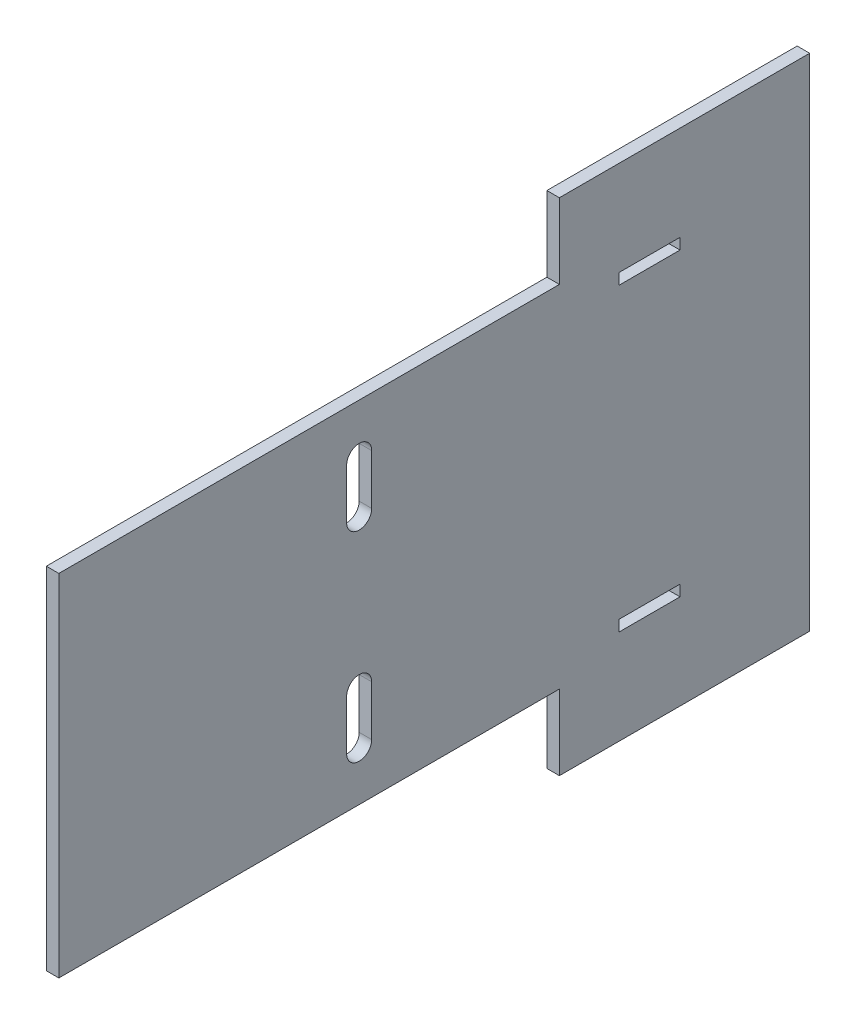
ISO-10303-21;
HEADER;
FILE_DESCRIPTION(('STEP AP214'),'2;1');
FILE_NAME('part.step','',(''),(''),'','','');
FILE_SCHEMA(('AUTOMOTIVE_DESIGN { 1 0 10303 214 1 1 1 1 }'));
ENDSEC;
DATA;
#1=APPLICATION_CONTEXT('core data for automotive mechanical design processes');
#2=APPLICATION_PROTOCOL_DEFINITION('international standard','automotive_design',2000,#1);
#3=PRODUCT_CONTEXT('',#1,'mechanical');
#4=PRODUCT('Part','Part','',(#3));
#5=PRODUCT_RELATED_PRODUCT_CATEGORY('part','',(#4));
#6=PRODUCT_DEFINITION_FORMATION('','',#4);
#7=PRODUCT_DEFINITION_CONTEXT('part definition',#1,'design');
#8=PRODUCT_DEFINITION('design','',#6,#7);
#9=PRODUCT_DEFINITION_SHAPE('','',#8);
#10=(LENGTH_UNIT() NAMED_UNIT(*) SI_UNIT(.MILLI.,.METRE.));
#11=(NAMED_UNIT(*) PLANE_ANGLE_UNIT() SI_UNIT($,.RADIAN.));
#12=(NAMED_UNIT(*) SI_UNIT($,.STERADIAN.) SOLID_ANGLE_UNIT());
#13=UNCERTAINTY_MEASURE_WITH_UNIT(LENGTH_MEASURE(1.E-05),#10,'distance_accuracy_value','');
#14=(GEOMETRIC_REPRESENTATION_CONTEXT(3) GLOBAL_UNCERTAINTY_ASSIGNED_CONTEXT((#13)) GLOBAL_UNIT_ASSIGNED_CONTEXT((#10,
#11,#12)) REPRESENTATION_CONTEXT('',''));
#15=CARTESIAN_POINT('',(0.,0.,0.));
#16=DIRECTION('',(0.,0.,1.));
#17=DIRECTION('',(1.,0.,0.));
#18=AXIS2_PLACEMENT_3D('',#15,#16,#17);
#19=CARTESIAN_POINT('',(2.5,35.,150.));
#20=DIRECTION('',(0.,0.,-1.));
#21=DIRECTION('',(-1.,0.,0.));
#22=AXIS2_PLACEMENT_3D('',#19,#20,#21);
#23=PLANE('',#22);
#24=DIRECTION('',(0.,-1.,0.));
#25=VECTOR('',#24,1.);
#26=CARTESIAN_POINT('',(0.,35.,150.));
#27=LINE('',#26,#25);
#28=CARTESIAN_POINT('',(0.,35.,150.));
#29=VERTEX_POINT('',#28);
#30=CARTESIAN_POINT('',(0.,-35.,150.));
#31=VERTEX_POINT('',#30);
#32=EDGE_CURVE('E297',#29,#31,#27,.T.);
#33=ORIENTED_EDGE('',*,*,#32,.T.);
#34=DIRECTION('',(-1.,0.,0.));
#35=VECTOR('',#34,1.);
#36=CARTESIAN_POINT('',(2.5,-35.,150.));
#37=LINE('',#36,#35);
#38=CARTESIAN_POINT('',(2.5,-35.,150.));
#39=VERTEX_POINT('',#38);
#40=EDGE_CURVE('E11',#39,#31,#37,.T.);
#41=ORIENTED_EDGE('',*,*,#40,.F.);
#42=DIRECTION('',(0.,-1.,0.));
#43=VECTOR('',#42,1.);
#44=CARTESIAN_POINT('',(2.5,35.,150.));
#45=LINE('',#44,#43);
#46=CARTESIAN_POINT('',(2.5,35.,150.));
#47=VERTEX_POINT('',#46);
#48=EDGE_CURVE('E334',#47,#39,#45,.T.);
#49=ORIENTED_EDGE('',*,*,#48,.F.);
#50=DIRECTION('',(-1.,0.,0.));
#51=VECTOR('',#50,1.);
#52=CARTESIAN_POINT('',(2.5,35.,150.));
#53=LINE('',#52,#51);
#54=EDGE_CURVE('E352',#47,#29,#53,.T.);
#55=ORIENTED_EDGE('',*,*,#54,.T.);
#56=EDGE_LOOP('',(#33,#41,#49,#55));
#57=FACE_BOUND('',#56,.T.);
#58=ADVANCED_FACE('F39',(#57),#23,.F.);
#59=CARTESIAN_POINT('',(2.5,-35.,150.));
#60=DIRECTION('',(0.,1.,0.));
#61=DIRECTION('',(0.,0.,1.));
#62=AXIS2_PLACEMENT_3D('',#59,#60,#61);
#63=PLANE('',#62);
#64=DIRECTION('',(0.,0.,-1.));
#65=VECTOR('',#64,1.);
#66=CARTESIAN_POINT('',(0.,-35.,150.));
#67=LINE('',#66,#65);
#68=CARTESIAN_POINT('',(0.,-35.,50.));
#69=VERTEX_POINT('',#68);
#70=EDGE_CURVE('E355',#31,#69,#67,.T.);
#71=ORIENTED_EDGE('',*,*,#70,.T.);
#72=DIRECTION('',(-1.,0.,0.));
#73=VECTOR('',#72,1.);
#74=CARTESIAN_POINT('',(2.5,-35.,50.));
#75=LINE('',#74,#73);
#76=CARTESIAN_POINT('',(2.5,-35.,50.));
#77=VERTEX_POINT('',#76);
#78=EDGE_CURVE('E46',#77,#69,#75,.T.);
#79=ORIENTED_EDGE('',*,*,#78,.F.);
#80=DIRECTION('',(0.,0.,-1.));
#81=VECTOR('',#80,1.);
#82=CARTESIAN_POINT('',(2.5,-35.,150.));
#83=LINE('',#82,#81);
#84=EDGE_CURVE('E337',#39,#77,#83,.T.);
#85=ORIENTED_EDGE('',*,*,#84,.F.);
#86=ORIENTED_EDGE('',*,*,#40,.T.);
#87=EDGE_LOOP('',(#71,#79,#85,#86));
#88=FACE_BOUND('',#87,.T.);
#89=ADVANCED_FACE('F411',(#88),#63,.F.);
#90=CARTESIAN_POINT('',(2.5,-35.,50.));
#91=DIRECTION('',(0.,0.,-1.));
#92=DIRECTION('',(0.,1.,0.));
#93=AXIS2_PLACEMENT_3D('',#90,#91,#92);
#94=PLANE('',#93);
#95=DIRECTION('',(0.,-1.,0.));
#96=VECTOR('',#95,1.);
#97=CARTESIAN_POINT('',(0.,-35.,50.));
#98=LINE('',#97,#96);
#99=CARTESIAN_POINT('',(0.,-50.,50.));
#100=VERTEX_POINT('',#99);
#101=EDGE_CURVE('E357',#69,#100,#98,.T.);
#102=ORIENTED_EDGE('',*,*,#101,.T.);
#103=DIRECTION('',(-1.,0.,0.));
#104=VECTOR('',#103,1.);
#105=CARTESIAN_POINT('',(2.5,-50.,50.));
#106=LINE('',#105,#104);
#107=CARTESIAN_POINT('',(2.5,-50.,50.));
#108=VERTEX_POINT('',#107);
#109=EDGE_CURVE('E383',#108,#100,#106,.T.);
#110=ORIENTED_EDGE('',*,*,#109,.F.);
#111=DIRECTION('',(0.,-1.,0.));
#112=VECTOR('',#111,1.);
#113=CARTESIAN_POINT('',(2.5,-35.,50.));
#114=LINE('',#113,#112);
#115=EDGE_CURVE('E340',#77,#108,#114,.T.);
#116=ORIENTED_EDGE('',*,*,#115,.F.);
#117=ORIENTED_EDGE('',*,*,#78,.T.);
#118=EDGE_LOOP('',(#102,#110,#116,#117));
#119=FACE_BOUND('',#118,.T.);
#120=ADVANCED_FACE('F390',(#119),#94,.F.);
#121=CARTESIAN_POINT('',(2.5,-50.,50.));
#122=DIRECTION('',(0.,1.,0.));
#123=DIRECTION('',(0.,0.,1.));
#124=AXIS2_PLACEMENT_3D('',#121,#122,#123);
#125=PLANE('',#124);
#126=DIRECTION('',(0.,0.,-1.));
#127=VECTOR('',#126,1.);
#128=CARTESIAN_POINT('',(0.,-50.,50.));
#129=LINE('',#128,#127);
#130=CARTESIAN_POINT('',(0.,-50.,0.));
#131=VERTEX_POINT('',#130);
#132=EDGE_CURVE('E359',#100,#131,#129,.T.);
#133=ORIENTED_EDGE('',*,*,#132,.T.);
#134=DIRECTION('',(-1.,0.,0.));
#135=VECTOR('',#134,1.);
#136=CARTESIAN_POINT('',(2.5,-50.,0.));
#137=LINE('',#136,#135);
#138=CARTESIAN_POINT('',(2.5,-50.,0.));
#139=VERTEX_POINT('',#138);
#140=EDGE_CURVE('E380',#139,#131,#137,.T.);
#141=ORIENTED_EDGE('',*,*,#140,.F.);
#142=DIRECTION('',(0.,0.,-1.));
#143=VECTOR('',#142,1.);
#144=CARTESIAN_POINT('',(2.5,-50.,50.));
#145=LINE('',#144,#143);
#146=EDGE_CURVE('E342',#108,#139,#145,.T.);
#147=ORIENTED_EDGE('',*,*,#146,.F.);
#148=ORIENTED_EDGE('',*,*,#109,.T.);
#149=EDGE_LOOP('',(#133,#141,#147,#148));
#150=FACE_BOUND('',#149,.T.);
#151=ADVANCED_FACE('F400',(#150),#125,.F.);
#152=CARTESIAN_POINT('',(2.5,0.,0.));
#153=DIRECTION('',(0.,0.,1.));
#154=DIRECTION('',(1.,0.,0.));
#155=AXIS2_PLACEMENT_3D('',#152,#153,#154);
#156=PLANE('',#155);
#157=DIRECTION('',(0.,1.,0.));
#158=VECTOR('',#157,1.);
#159=CARTESIAN_POINT('',(0.,0.,0.));
#160=LINE('',#159,#158);
#161=CARTESIAN_POINT('',(0.,50.,0.));
#162=VERTEX_POINT('',#161);
#163=EDGE_CURVE('E362',#131,#162,#160,.T.);
#164=ORIENTED_EDGE('',*,*,#163,.T.);
#165=DIRECTION('',(-1.,0.,0.));
#166=VECTOR('',#165,1.);
#167=CARTESIAN_POINT('',(2.5,50.,0.));
#168=LINE('',#167,#166);
#169=CARTESIAN_POINT('',(2.5,50.,0.));
#170=VERTEX_POINT('',#169);
#171=EDGE_CURVE('E377',#170,#162,#168,.T.);
#172=ORIENTED_EDGE('',*,*,#171,.F.);
#173=DIRECTION('',(0.,1.,0.));
#174=VECTOR('',#173,1.);
#175=CARTESIAN_POINT('',(2.5,-50.,0.));
#176=LINE('',#175,#174);
#177=EDGE_CURVE('E344',#139,#170,#176,.T.);
#178=ORIENTED_EDGE('',*,*,#177,.F.);
#179=ORIENTED_EDGE('',*,*,#140,.T.);
#180=EDGE_LOOP('',(#164,#172,#178,#179));
#181=FACE_BOUND('',#180,.T.);
#182=ADVANCED_FACE('F404',(#181),#156,.F.);
#183=CARTESIAN_POINT('',(2.5,50.,0.));
#184=DIRECTION('',(0.,-1.,0.));
#185=DIRECTION('',(0.,0.,-1.));
#186=AXIS2_PLACEMENT_3D('',#183,#184,#185);
#187=PLANE('',#186);
#188=DIRECTION('',(0.,0.,1.));
#189=VECTOR('',#188,1.);
#190=CARTESIAN_POINT('',(0.,50.,0.));
#191=LINE('',#190,#189);
#192=CARTESIAN_POINT('',(0.,50.,50.));
#193=VERTEX_POINT('',#192);
#194=EDGE_CURVE('E364',#162,#193,#191,.T.);
#195=ORIENTED_EDGE('',*,*,#194,.T.);
#196=DIRECTION('',(-1.,0.,0.));
#197=VECTOR('',#196,1.);
#198=CARTESIAN_POINT('',(2.5,50.,50.));
#199=LINE('',#198,#197);
#200=CARTESIAN_POINT('',(2.5,50.,50.));
#201=VERTEX_POINT('',#200);
#202=EDGE_CURVE('E374',#201,#193,#199,.T.);
#203=ORIENTED_EDGE('',*,*,#202,.F.);
#204=DIRECTION('',(0.,0.,1.));
#205=VECTOR('',#204,1.);
#206=CARTESIAN_POINT('',(2.5,50.,0.));
#207=LINE('',#206,#205);
#208=EDGE_CURVE('E346',#170,#201,#207,.T.);
#209=ORIENTED_EDGE('',*,*,#208,.F.);
#210=ORIENTED_EDGE('',*,*,#171,.T.);
#211=EDGE_LOOP('',(#195,#203,#209,#210));
#212=FACE_BOUND('',#211,.T.);
#213=ADVANCED_FACE('F424',(#212),#187,.F.);
#214=CARTESIAN_POINT('',(2.5,50.,50.));
#215=DIRECTION('',(0.,0.,-1.));
#216=DIRECTION('',(-1.,0.,0.));
#217=AXIS2_PLACEMENT_3D('',#214,#215,#216);
#218=PLANE('',#217);
#219=DIRECTION('',(0.,-1.,0.));
#220=VECTOR('',#219,1.);
#221=CARTESIAN_POINT('',(0.,50.,50.));
#222=LINE('',#221,#220);
#223=CARTESIAN_POINT('',(0.,35.,50.));
#224=VERTEX_POINT('',#223);
#225=EDGE_CURVE('E366',#193,#224,#222,.T.);
#226=ORIENTED_EDGE('',*,*,#225,.T.);
#227=DIRECTION('',(-1.,0.,0.));
#228=VECTOR('',#227,1.);
#229=CARTESIAN_POINT('',(2.5,35.,50.));
#230=LINE('',#229,#228);
#231=CARTESIAN_POINT('',(2.5,35.,50.));
#232=VERTEX_POINT('',#231);
#233=EDGE_CURVE('E371',#232,#224,#230,.T.);
#234=ORIENTED_EDGE('',*,*,#233,.F.);
#235=DIRECTION('',(0.,-1.,0.));
#236=VECTOR('',#235,1.);
#237=CARTESIAN_POINT('',(2.5,50.,50.));
#238=LINE('',#237,#236);
#239=EDGE_CURVE('E348',#201,#232,#238,.T.);
#240=ORIENTED_EDGE('',*,*,#239,.F.);
#241=ORIENTED_EDGE('',*,*,#202,.T.);
#242=EDGE_LOOP('',(#226,#234,#240,#241));
#243=FACE_BOUND('',#242,.T.);
#244=ADVANCED_FACE('F422',(#243),#218,.F.);
#245=CARTESIAN_POINT('',(2.5,35.,50.));
#246=DIRECTION('',(0.,-1.,0.));
#247=DIRECTION('',(0.,0.,-1.));
#248=AXIS2_PLACEMENT_3D('',#245,#246,#247);
#249=PLANE('',#248);
#250=DIRECTION('',(0.,0.,1.));
#251=VECTOR('',#250,1.);
#252=CARTESIAN_POINT('',(0.,35.,50.));
#253=LINE('',#252,#251);
#254=EDGE_CURVE('E338',#224,#29,#253,.T.);
#255=ORIENTED_EDGE('',*,*,#254,.T.);
#256=ORIENTED_EDGE('',*,*,#54,.F.);
#257=DIRECTION('',(0.,0.,1.));
#258=VECTOR('',#257,1.);
#259=CARTESIAN_POINT('',(2.5,35.,50.));
#260=LINE('',#259,#258);
#261=EDGE_CURVE('E350',#232,#47,#260,.T.);
#262=ORIENTED_EDGE('',*,*,#261,.F.);
#263=ORIENTED_EDGE('',*,*,#233,.T.);
#264=EDGE_LOOP('',(#255,#256,#262,#263));
#265=FACE_BOUND('',#264,.T.);
#266=ADVANCED_FACE('F417',(#265),#249,.F.);
#267=CARTESIAN_POINT('',(2.5,0.,0.));
#268=DIRECTION('',(1.,0.,0.));
#269=DIRECTION('',(0.,0.,-1.));
#270=AXIS2_PLACEMENT_3D('',#267,#268,#269);
#271=PLANE('',#270);
#272=CARTESIAN_POINT('',(2.5,25.,90.));
#273=DIRECTION('',(-1.,0.,0.));
#274=DIRECTION('',(0.,0.,-1.));
#275=AXIS2_PLACEMENT_3D('',#272,#273,#274);
#276=CIRCLE('',#275,2.5);
#277=CARTESIAN_POINT('',(2.5,25.,92.5));
#278=VERTEX_POINT('',#277);
#279=CARTESIAN_POINT('',(2.5,25.,87.5));
#280=VERTEX_POINT('',#279);
#281=EDGE_CURVE('E203',#278,#280,#276,.T.);
#282=ORIENTED_EDGE('',*,*,#281,.T.);
#283=DIRECTION('',(0.,-1.,0.));
#284=VECTOR('',#283,1.);
#285=CARTESIAN_POINT('',(2.5,15.,87.5));
#286=LINE('',#285,#284);
#287=CARTESIAN_POINT('',(2.5,15.,87.5));
#288=VERTEX_POINT('',#287);
#289=EDGE_CURVE('E214',#280,#288,#286,.T.);
#290=ORIENTED_EDGE('',*,*,#289,.T.);
#291=CARTESIAN_POINT('',(2.5,15.,90.));
#292=DIRECTION('',(-1.,0.,0.));
#293=DIRECTION('',(0.,0.,-1.));
#294=AXIS2_PLACEMENT_3D('',#291,#292,#293);
#295=CIRCLE('',#294,2.5);
#296=CARTESIAN_POINT('',(2.5,15.,92.5));
#297=VERTEX_POINT('',#296);
#298=EDGE_CURVE('E53',#288,#297,#295,.T.);
#299=ORIENTED_EDGE('',*,*,#298,.T.);
#300=DIRECTION('',(0.,1.,0.));
#301=VECTOR('',#300,1.);
#302=CARTESIAN_POINT('',(2.5,25.,92.5));
#303=LINE('',#302,#301);
#304=EDGE_CURVE('E211',#297,#278,#303,.T.);
#305=ORIENTED_EDGE('',*,*,#304,.T.);
#306=EDGE_LOOP('',(#282,#290,#299,#305));
#307=FACE_BOUND('',#306,.T.);
#308=CARTESIAN_POINT('',(2.5,-15.,90.));
#309=DIRECTION('',(-1.,0.,0.));
#310=DIRECTION('',(0.,0.,1.));
#311=AXIS2_PLACEMENT_3D('',#308,#309,#310);
#312=CIRCLE('',#311,2.5);
#313=CARTESIAN_POINT('',(2.5,-15.,92.5));
#314=VERTEX_POINT('',#313);
#315=CARTESIAN_POINT('',(2.5,-15.,87.5));
#316=VERTEX_POINT('',#315);
#317=EDGE_CURVE('E255',#314,#316,#312,.T.);
#318=ORIENTED_EDGE('',*,*,#317,.T.);
#319=DIRECTION('',(0.,-1.,0.));
#320=VECTOR('',#319,1.);
#321=CARTESIAN_POINT('',(2.5,-25.,87.5));
#322=LINE('',#321,#320);
#323=CARTESIAN_POINT('',(2.5,-25.,87.5));
#324=VERTEX_POINT('',#323);
#325=EDGE_CURVE('E265',#316,#324,#322,.T.);
#326=ORIENTED_EDGE('',*,*,#325,.T.);
#327=CARTESIAN_POINT('',(2.5,-25.,90.));
#328=DIRECTION('',(-1.,0.,0.));
#329=DIRECTION('',(0.,0.,-1.));
#330=AXIS2_PLACEMENT_3D('',#327,#328,#329);
#331=CIRCLE('',#330,2.5);
#332=CARTESIAN_POINT('',(2.5,-25.,92.5));
#333=VERTEX_POINT('',#332);
#334=EDGE_CURVE('E61',#324,#333,#331,.T.);
#335=ORIENTED_EDGE('',*,*,#334,.T.);
#336=DIRECTION('',(0.,1.,0.));
#337=VECTOR('',#336,1.);
#338=CARTESIAN_POINT('',(2.5,-15.,92.5));
#339=LINE('',#338,#337);
#340=EDGE_CURVE('E244',#333,#314,#339,.T.);
#341=ORIENTED_EDGE('',*,*,#340,.T.);
#342=EDGE_LOOP('',(#318,#326,#335,#341));
#343=FACE_BOUND('',#342,.T.);
#344=DIRECTION('',(0.,1.,0.));
#345=VECTOR('',#344,1.);
#346=CARTESIAN_POINT('',(2.5,31.0999999999997,38.0999999999999));
#347=LINE('',#346,#345);
#348=CARTESIAN_POINT('',(2.5,28.8999999999997,38.0999999999999));
#349=VERTEX_POINT('',#348);
#350=CARTESIAN_POINT('',(2.5,31.0999999999997,38.0999999999999));
#351=VERTEX_POINT('',#350);
#352=EDGE_CURVE('E270',#349,#351,#347,.T.);
#353=ORIENTED_EDGE('',*,*,#352,.T.);
#354=DIRECTION('',(0.,0.,-1.));
#355=VECTOR('',#354,1.);
#356=CARTESIAN_POINT('',(2.5,31.0999999999997,25.8999999999999));
#357=LINE('',#356,#355);
#358=CARTESIAN_POINT('',(2.5,31.0999999999997,25.8999999999999));
#359=VERTEX_POINT('',#358);
#360=EDGE_CURVE('E273',#351,#359,#357,.T.);
#361=ORIENTED_EDGE('',*,*,#360,.T.);
#362=DIRECTION('',(0.,-1.,0.));
#363=VECTOR('',#362,1.);
#364=CARTESIAN_POINT('',(2.5,28.8999999999997,25.8999999999999));
#365=LINE('',#364,#363);
#366=CARTESIAN_POINT('',(2.5,28.8999999999997,25.8999999999999));
#367=VERTEX_POINT('',#366);
#368=EDGE_CURVE('E277',#359,#367,#365,.T.);
#369=ORIENTED_EDGE('',*,*,#368,.T.);
#370=DIRECTION('',(0.,0.,1.));
#371=VECTOR('',#370,1.);
#372=CARTESIAN_POINT('',(2.5,28.8999999999997,38.0999999999999));
#373=LINE('',#372,#371);
#374=EDGE_CURVE('E280',#367,#349,#373,.T.);
#375=ORIENTED_EDGE('',*,*,#374,.T.);
#376=EDGE_LOOP('',(#353,#361,#369,#375));
#377=FACE_BOUND('',#376,.T.);
#378=DIRECTION('',(0.,0.,-1.));
#379=VECTOR('',#378,1.);
#380=CARTESIAN_POINT('',(2.5,-28.8999999999997,38.0999999999999));
#381=LINE('',#380,#379);
#382=CARTESIAN_POINT('',(2.5,-28.8999999999997,38.0999999999999));
#383=VERTEX_POINT('',#382);
#384=CARTESIAN_POINT('',(2.5,-28.8999999999997,25.8999999999999));
#385=VERTEX_POINT('',#384);
#386=EDGE_CURVE('E317',#383,#385,#381,.T.);
#387=ORIENTED_EDGE('',*,*,#386,.T.);
#388=DIRECTION('',(0.,-1.,0.));
#389=VECTOR('',#388,1.);
#390=CARTESIAN_POINT('',(2.5,-28.8999999999997,25.8999999999999));
#391=LINE('',#390,#389);
#392=CARTESIAN_POINT('',(2.5,-31.0999999999997,25.8999999999999));
#393=VERTEX_POINT('',#392);
#394=EDGE_CURVE('E329',#385,#393,#391,.T.);
#395=ORIENTED_EDGE('',*,*,#394,.T.);
#396=DIRECTION('',(0.,0.,1.));
#397=VECTOR('',#396,1.);
#398=CARTESIAN_POINT('',(2.5,-31.0999999999997,38.0999999999999));
#399=LINE('',#398,#397);
#400=CARTESIAN_POINT('',(2.5,-31.0999999999997,38.0999999999999));
#401=VERTEX_POINT('',#400);
#402=EDGE_CURVE('E326',#393,#401,#399,.T.);
#403=ORIENTED_EDGE('',*,*,#402,.T.);
#404=DIRECTION('',(0.,1.,0.));
#405=VECTOR('',#404,1.);
#406=CARTESIAN_POINT('',(2.5,-28.8999999999997,38.0999999999999));
#407=LINE('',#406,#405);
#408=EDGE_CURVE('E307',#401,#383,#407,.T.);
#409=ORIENTED_EDGE('',*,*,#408,.T.);
#410=EDGE_LOOP('',(#387,#395,#403,#409));
#411=FACE_BOUND('',#410,.T.);
#412=ORIENTED_EDGE('',*,*,#48,.T.);
#413=ORIENTED_EDGE('',*,*,#84,.T.);
#414=ORIENTED_EDGE('',*,*,#115,.T.);
#415=ORIENTED_EDGE('',*,*,#146,.T.);
#416=ORIENTED_EDGE('',*,*,#177,.T.);
#417=ORIENTED_EDGE('',*,*,#208,.T.);
#418=ORIENTED_EDGE('',*,*,#239,.T.);
#419=ORIENTED_EDGE('',*,*,#261,.T.);
#420=EDGE_LOOP('',(#412,#413,#414,#415,#416,#417,#418,#419));
#421=FACE_BOUND('',#420,.T.);
#422=ADVANCED_FACE('F218',(#307,#343,#377,#411,#421),#271,.T.);
#423=CARTESIAN_POINT('',(0.,0.,0.));
#424=DIRECTION('',(1.,0.,0.));
#425=DIRECTION('',(0.,0.,-1.));
#426=AXIS2_PLACEMENT_3D('',#423,#424,#425);
#427=PLANE('',#426);
#428=DIRECTION('',(0.,-1.,0.));
#429=VECTOR('',#428,1.);
#430=CARTESIAN_POINT('',(0.,15.,87.5));
#431=LINE('',#430,#429);
#432=CARTESIAN_POINT('',(0.,25.,87.5));
#433=VERTEX_POINT('',#432);
#434=CARTESIAN_POINT('',(0.,15.,87.5));
#435=VERTEX_POINT('',#434);
#436=EDGE_CURVE('E230',#433,#435,#431,.T.);
#437=ORIENTED_EDGE('',*,*,#436,.F.);
#438=CARTESIAN_POINT('',(0.,25.,90.));
#439=DIRECTION('',(-1.,0.,0.));
#440=DIRECTION('',(0.,0.,-1.));
#441=AXIS2_PLACEMENT_3D('',#438,#439,#440);
#442=CIRCLE('',#441,2.5);
#443=CARTESIAN_POINT('',(0.,25.,92.5));
#444=VERTEX_POINT('',#443);
#445=EDGE_CURVE('E206',#444,#433,#442,.T.);
#446=ORIENTED_EDGE('',*,*,#445,.F.);
#447=DIRECTION('',(0.,1.,0.));
#448=VECTOR('',#447,1.);
#449=CARTESIAN_POINT('',(0.,25.,92.5));
#450=LINE('',#449,#448);
#451=CARTESIAN_POINT('',(0.,15.,92.5));
#452=VERTEX_POINT('',#451);
#453=EDGE_CURVE('E221',#452,#444,#450,.T.);
#454=ORIENTED_EDGE('',*,*,#453,.F.);
#455=CARTESIAN_POINT('',(0.,15.,90.));
#456=DIRECTION('',(-1.,0.,0.));
#457=DIRECTION('',(0.,0.,-1.));
#458=AXIS2_PLACEMENT_3D('',#455,#456,#457);
#459=CIRCLE('',#458,2.5);
#460=EDGE_CURVE('E224',#435,#452,#459,.T.);
#461=ORIENTED_EDGE('',*,*,#460,.F.);
#462=EDGE_LOOP('',(#437,#446,#454,#461));
#463=FACE_BOUND('',#462,.T.);
#464=DIRECTION('',(0.,-1.,0.));
#465=VECTOR('',#464,1.);
#466=CARTESIAN_POINT('',(0.,-25.,87.5));
#467=LINE('',#466,#465);
#468=CARTESIAN_POINT('',(0.,-15.,87.5));
#469=VERTEX_POINT('',#468);
#470=CARTESIAN_POINT('',(0.,-25.,87.5));
#471=VERTEX_POINT('',#470);
#472=EDGE_CURVE('E258',#469,#471,#467,.T.);
#473=ORIENTED_EDGE('',*,*,#472,.F.);
#474=CARTESIAN_POINT('',(0.,-15.,90.));
#475=DIRECTION('',(-1.,0.,0.));
#476=DIRECTION('',(0.,0.,1.));
#477=AXIS2_PLACEMENT_3D('',#474,#475,#476);
#478=CIRCLE('',#477,2.5);
#479=CARTESIAN_POINT('',(0.,-15.,92.5));
#480=VERTEX_POINT('',#479);
#481=EDGE_CURVE('E231',#480,#469,#478,.T.);
#482=ORIENTED_EDGE('',*,*,#481,.F.);
#483=DIRECTION('',(0.,1.,0.));
#484=VECTOR('',#483,1.);
#485=CARTESIAN_POINT('',(0.,-15.,92.5));
#486=LINE('',#485,#484);
#487=CARTESIAN_POINT('',(0.,-25.,92.5));
#488=VERTEX_POINT('',#487);
#489=EDGE_CURVE('E251',#488,#480,#486,.T.);
#490=ORIENTED_EDGE('',*,*,#489,.F.);
#491=CARTESIAN_POINT('',(0.,-25.,90.));
#492=DIRECTION('',(-1.,0.,0.));
#493=DIRECTION('',(0.,0.,-1.));
#494=AXIS2_PLACEMENT_3D('',#491,#492,#493);
#495=CIRCLE('',#494,2.5);
#496=EDGE_CURVE('E254',#471,#488,#495,.T.);
#497=ORIENTED_EDGE('',*,*,#496,.F.);
#498=EDGE_LOOP('',(#473,#482,#490,#497));
#499=FACE_BOUND('',#498,.T.);
#500=DIRECTION('',(0.,0.,-1.));
#501=VECTOR('',#500,1.);
#502=CARTESIAN_POINT('',(0.,31.0999999999997,25.8999999999999));
#503=LINE('',#502,#501);
#504=CARTESIAN_POINT('',(0.,31.0999999999997,38.0999999999999));
#505=VERTEX_POINT('',#504);
#506=CARTESIAN_POINT('',(0.,31.0999999999997,25.8999999999999));
#507=VERTEX_POINT('',#506);
#508=EDGE_CURVE('E286',#505,#507,#503,.T.);
#509=ORIENTED_EDGE('',*,*,#508,.F.);
#510=DIRECTION('',(0.,1.,0.));
#511=VECTOR('',#510,1.);
#512=CARTESIAN_POINT('',(0.,31.0999999999997,38.0999999999999));
#513=LINE('',#512,#511);
#514=CARTESIAN_POINT('',(0.,28.8999999999997,38.0999999999999));
#515=VERTEX_POINT('',#514);
#516=EDGE_CURVE('E284',#515,#505,#513,.T.);
#517=ORIENTED_EDGE('',*,*,#516,.F.);
#518=DIRECTION('',(0.,0.,1.));
#519=VECTOR('',#518,1.);
#520=CARTESIAN_POINT('',(0.,28.8999999999997,38.0999999999999));
#521=LINE('',#520,#519);
#522=CARTESIAN_POINT('',(0.,28.8999999999997,25.8999999999999));
#523=VERTEX_POINT('',#522);
#524=EDGE_CURVE('E274',#523,#515,#521,.T.);
#525=ORIENTED_EDGE('',*,*,#524,.F.);
#526=DIRECTION('',(0.,-1.,0.));
#527=VECTOR('',#526,1.);
#528=CARTESIAN_POINT('',(0.,28.8999999999997,25.8999999999999));
#529=LINE('',#528,#527);
#530=EDGE_CURVE('E290',#507,#523,#529,.T.);
#531=ORIENTED_EDGE('',*,*,#530,.F.);
#532=EDGE_LOOP('',(#509,#517,#525,#531));
#533=FACE_BOUND('',#532,.T.);
#534=DIRECTION('',(0.,-1.,0.));
#535=VECTOR('',#534,1.);
#536=CARTESIAN_POINT('',(0.,-28.8999999999997,25.8999999999999));
#537=LINE('',#536,#535);
#538=CARTESIAN_POINT('',(0.,-28.8999999999997,25.8999999999999));
#539=VERTEX_POINT('',#538);
#540=CARTESIAN_POINT('',(0.,-31.0999999999997,25.8999999999999));
#541=VERTEX_POINT('',#540);
#542=EDGE_CURVE('E320',#539,#541,#537,.T.);
#543=ORIENTED_EDGE('',*,*,#542,.F.);
#544=DIRECTION('',(0.,0.,-1.));
#545=VECTOR('',#544,1.);
#546=CARTESIAN_POINT('',(0.,-28.8999999999997,38.0999999999999));
#547=LINE('',#546,#545);
#548=CARTESIAN_POINT('',(0.,-28.8999999999997,38.0999999999999));
#549=VERTEX_POINT('',#548);
#550=EDGE_CURVE('E287',#549,#539,#547,.T.);
#551=ORIENTED_EDGE('',*,*,#550,.F.);
#552=DIRECTION('',(0.,1.,0.));
#553=VECTOR('',#552,1.);
#554=CARTESIAN_POINT('',(0.,-28.8999999999997,38.0999999999999));
#555=LINE('',#554,#553);
#556=CARTESIAN_POINT('',(0.,-31.0999999999997,38.0999999999999));
#557=VERTEX_POINT('',#556);
#558=EDGE_CURVE('E313',#557,#549,#555,.T.);
#559=ORIENTED_EDGE('',*,*,#558,.F.);
#560=DIRECTION('',(0.,0.,1.));
#561=VECTOR('',#560,1.);
#562=CARTESIAN_POINT('',(0.,-31.0999999999997,38.0999999999999));
#563=LINE('',#562,#561);
#564=EDGE_CURVE('E316',#541,#557,#563,.T.);
#565=ORIENTED_EDGE('',*,*,#564,.F.);
#566=EDGE_LOOP('',(#543,#551,#559,#565));
#567=FACE_BOUND('',#566,.T.);
#568=ORIENTED_EDGE('',*,*,#32,.F.);
#569=ORIENTED_EDGE('',*,*,#254,.F.);
#570=ORIENTED_EDGE('',*,*,#225,.F.);
#571=ORIENTED_EDGE('',*,*,#194,.F.);
#572=ORIENTED_EDGE('',*,*,#163,.F.);
#573=ORIENTED_EDGE('',*,*,#132,.F.);
#574=ORIENTED_EDGE('',*,*,#101,.F.);
#575=ORIENTED_EDGE('',*,*,#70,.F.);
#576=EDGE_LOOP('',(#568,#569,#570,#571,#572,#573,#574,#575));
#577=FACE_BOUND('',#576,.T.);
#578=ADVANCED_FACE('F396',(#463,#499,#533,#567,#577),#427,.F.);
#579=CARTESIAN_POINT('',(2.5,-28.8999999999997,38.0999999999999));
#580=DIRECTION('',(0.,1.,0.));
#581=DIRECTION('',(0.,0.,1.));
#582=AXIS2_PLACEMENT_3D('',#579,#580,#581);
#583=PLANE('',#582);
#584=ORIENTED_EDGE('',*,*,#550,.T.);
#585=DIRECTION('',(-1.,0.,0.));
#586=VECTOR('',#585,1.);
#587=CARTESIAN_POINT('',(2.5,-28.8999999999997,25.8999999999999));
#588=LINE('',#587,#586);
#589=EDGE_CURVE('E304',#385,#539,#588,.T.);
#590=ORIENTED_EDGE('',*,*,#589,.F.);
#591=ORIENTED_EDGE('',*,*,#386,.F.);
#592=DIRECTION('',(-1.,0.,0.));
#593=VECTOR('',#592,1.);
#594=CARTESIAN_POINT('',(2.5,-28.8999999999997,38.0999999999999));
#595=LINE('',#594,#593);
#596=EDGE_CURVE('E237',#383,#549,#595,.T.);
#597=ORIENTED_EDGE('',*,*,#596,.T.);
#598=EDGE_LOOP('',(#584,#590,#591,#597));
#599=FACE_BOUND('',#598,.T.);
#600=ADVANCED_FACE('F492',(#599),#583,.F.);
#601=CARTESIAN_POINT('',(2.5,-28.8999999999997,38.0999999999999));
#602=DIRECTION('',(0.,0.,1.));
#603=DIRECTION('',(0.,-1.,0.));
#604=AXIS2_PLACEMENT_3D('',#601,#602,#603);
#605=PLANE('',#604);
#606=ORIENTED_EDGE('',*,*,#558,.T.);
#607=ORIENTED_EDGE('',*,*,#596,.F.);
#608=ORIENTED_EDGE('',*,*,#408,.F.);
#609=DIRECTION('',(-1.,0.,0.));
#610=VECTOR('',#609,1.);
#611=CARTESIAN_POINT('',(2.5,-31.0999999999997,38.0999999999999));
#612=LINE('',#611,#610);
#613=EDGE_CURVE('E310',#401,#557,#612,.T.);
#614=ORIENTED_EDGE('',*,*,#613,.T.);
#615=EDGE_LOOP('',(#606,#607,#608,#614));
#616=FACE_BOUND('',#615,.T.);
#617=ADVANCED_FACE('F502',(#616),#605,.F.);
#618=CARTESIAN_POINT('',(2.5,-31.0999999999997,38.0999999999999));
#619=DIRECTION('',(0.,-1.,0.));
#620=DIRECTION('',(0.,0.,-1.));
#621=AXIS2_PLACEMENT_3D('',#618,#619,#620);
#622=PLANE('',#621);
#623=ORIENTED_EDGE('',*,*,#564,.T.);
#624=ORIENTED_EDGE('',*,*,#613,.F.);
#625=ORIENTED_EDGE('',*,*,#402,.F.);
#626=DIRECTION('',(-1.,0.,0.));
#627=VECTOR('',#626,1.);
#628=CARTESIAN_POINT('',(2.5,-31.0999999999997,25.8999999999999));
#629=LINE('',#628,#627);
#630=EDGE_CURVE('E308',#393,#541,#629,.T.);
#631=ORIENTED_EDGE('',*,*,#630,.T.);
#632=EDGE_LOOP('',(#623,#624,#625,#631));
#633=FACE_BOUND('',#632,.T.);
#634=ADVANCED_FACE('F512',(#633),#622,.F.);
#635=CARTESIAN_POINT('',(2.5,-28.8999999999997,25.8999999999999));
#636=DIRECTION('',(0.,0.,-1.));
#637=DIRECTION('',(0.,1.,0.));
#638=AXIS2_PLACEMENT_3D('',#635,#636,#637);
#639=PLANE('',#638);
#640=ORIENTED_EDGE('',*,*,#542,.T.);
#641=ORIENTED_EDGE('',*,*,#630,.F.);
#642=ORIENTED_EDGE('',*,*,#394,.F.);
#643=ORIENTED_EDGE('',*,*,#589,.T.);
#644=EDGE_LOOP('',(#640,#641,#642,#643));
#645=FACE_BOUND('',#644,.T.);
#646=ADVANCED_FACE('F522',(#645),#639,.F.);
#647=CARTESIAN_POINT('',(2.5,31.0999999999997,38.0999999999999));
#648=DIRECTION('',(0.,0.,1.));
#649=DIRECTION('',(1.,0.,0.));
#650=AXIS2_PLACEMENT_3D('',#647,#648,#649);
#651=PLANE('',#650);
#652=ORIENTED_EDGE('',*,*,#516,.T.);
#653=DIRECTION('',(-1.,0.,0.));
#654=VECTOR('',#653,1.);
#655=CARTESIAN_POINT('',(2.5,31.0999999999997,38.0999999999999));
#656=LINE('',#655,#654);
#657=EDGE_CURVE('E283',#351,#505,#656,.T.);
#658=ORIENTED_EDGE('',*,*,#657,.F.);
#659=ORIENTED_EDGE('',*,*,#352,.F.);
#660=DIRECTION('',(-1.,0.,0.));
#661=VECTOR('',#660,1.);
#662=CARTESIAN_POINT('',(2.5,28.8999999999997,38.0999999999999));
#663=LINE('',#662,#661);
#664=EDGE_CURVE('E295',#349,#515,#663,.T.);
#665=ORIENTED_EDGE('',*,*,#664,.T.);
#666=EDGE_LOOP('',(#652,#658,#659,#665));
#667=FACE_BOUND('',#666,.T.);
#668=ADVANCED_FACE('F532',(#667),#651,.F.);
#669=CARTESIAN_POINT('',(2.5,28.8999999999997,38.0999999999999));
#670=DIRECTION('',(0.,-1.,0.));
#671=DIRECTION('',(0.,0.,-1.));
#672=AXIS2_PLACEMENT_3D('',#669,#670,#671);
#673=PLANE('',#672);
#674=ORIENTED_EDGE('',*,*,#524,.T.);
#675=ORIENTED_EDGE('',*,*,#664,.F.);
#676=ORIENTED_EDGE('',*,*,#374,.F.);
#677=DIRECTION('',(-1.,0.,0.));
#678=VECTOR('',#677,1.);
#679=CARTESIAN_POINT('',(2.5,28.8999999999997,25.8999999999999));
#680=LINE('',#679,#678);
#681=EDGE_CURVE('E298',#367,#523,#680,.T.);
#682=ORIENTED_EDGE('',*,*,#681,.T.);
#683=EDGE_LOOP('',(#674,#675,#676,#682));
#684=FACE_BOUND('',#683,.T.);
#685=ADVANCED_FACE('F542',(#684),#673,.F.);
#686=CARTESIAN_POINT('',(2.5,28.8999999999997,25.8999999999999));
#687=DIRECTION('',(0.,0.,-1.));
#688=DIRECTION('',(-1.,0.,0.));
#689=AXIS2_PLACEMENT_3D('',#686,#687,#688);
#690=PLANE('',#689);
#691=ORIENTED_EDGE('',*,*,#530,.T.);
#692=ORIENTED_EDGE('',*,*,#681,.F.);
#693=ORIENTED_EDGE('',*,*,#368,.F.);
#694=DIRECTION('',(-1.,0.,0.));
#695=VECTOR('',#694,1.);
#696=CARTESIAN_POINT('',(2.5,31.0999999999997,25.8999999999999));
#697=LINE('',#696,#695);
#698=EDGE_CURVE('E300',#359,#507,#697,.T.);
#699=ORIENTED_EDGE('',*,*,#698,.T.);
#700=EDGE_LOOP('',(#691,#692,#693,#699));
#701=FACE_BOUND('',#700,.T.);
#702=ADVANCED_FACE('F552',(#701),#690,.F.);
#703=CARTESIAN_POINT('',(2.5,31.0999999999997,25.8999999999999));
#704=DIRECTION('',(0.,1.,0.));
#705=DIRECTION('',(0.,0.,1.));
#706=AXIS2_PLACEMENT_3D('',#703,#704,#705);
#707=PLANE('',#706);
#708=ORIENTED_EDGE('',*,*,#508,.T.);
#709=ORIENTED_EDGE('',*,*,#698,.F.);
#710=ORIENTED_EDGE('',*,*,#360,.F.);
#711=ORIENTED_EDGE('',*,*,#657,.T.);
#712=EDGE_LOOP('',(#708,#709,#710,#711));
#713=FACE_BOUND('',#712,.T.);
#714=ADVANCED_FACE('F562',(#713),#707,.F.);
#715=CARTESIAN_POINT('',(2.5,-15.,90.));
#716=DIRECTION('',(-1.,0.,0.));
#717=DIRECTION('',(0.,0.,1.));
#718=AXIS2_PLACEMENT_3D('',#715,#716,#717);
#719=CYLINDRICAL_SURFACE('',#718,2.5);
#720=ORIENTED_EDGE('',*,*,#481,.T.);
#721=DIRECTION('',(-1.,0.,0.));
#722=VECTOR('',#721,1.);
#723=CARTESIAN_POINT('',(2.5,-15.,87.5));
#724=LINE('',#723,#722);
#725=EDGE_CURVE('E241',#316,#469,#724,.T.);
#726=ORIENTED_EDGE('',*,*,#725,.F.);
#727=ORIENTED_EDGE('',*,*,#317,.F.);
#728=DIRECTION('',(-1.,0.,0.));
#729=VECTOR('',#728,1.);
#730=CARTESIAN_POINT('',(2.5,-15.,92.5));
#731=LINE('',#730,#729);
#732=EDGE_CURVE('E249',#314,#480,#731,.T.);
#733=ORIENTED_EDGE('',*,*,#732,.T.);
#734=EDGE_LOOP('',(#720,#726,#727,#733));
#735=FACE_BOUND('',#734,.T.);
#736=ADVANCED_FACE('F571',(#735),#719,.F.);
#737=CARTESIAN_POINT('',(2.5,-15.,92.5));
#738=DIRECTION('',(0.,0.,1.));
#739=DIRECTION('',(1.,0.,0.));
#740=AXIS2_PLACEMENT_3D('',#737,#738,#739);
#741=PLANE('',#740);
#742=ORIENTED_EDGE('',*,*,#489,.T.);
#743=ORIENTED_EDGE('',*,*,#732,.F.);
#744=ORIENTED_EDGE('',*,*,#340,.F.);
#745=DIRECTION('',(-1.,0.,0.));
#746=VECTOR('',#745,1.);
#747=CARTESIAN_POINT('',(2.5,-25.,92.5));
#748=LINE('',#747,#746);
#749=EDGE_CURVE('E247',#333,#488,#748,.T.);
#750=ORIENTED_EDGE('',*,*,#749,.T.);
#751=EDGE_LOOP('',(#742,#743,#744,#750));
#752=FACE_BOUND('',#751,.T.);
#753=ADVANCED_FACE('F580',(#752),#741,.F.);
#754=CARTESIAN_POINT('',(2.5,-25.,90.));
#755=DIRECTION('',(-1.,0.,0.));
#756=DIRECTION('',(0.,0.,1.));
#757=AXIS2_PLACEMENT_3D('',#754,#755,#756);
#758=CYLINDRICAL_SURFACE('',#757,2.5);
#759=ORIENTED_EDGE('',*,*,#496,.T.);
#760=ORIENTED_EDGE('',*,*,#749,.F.);
#761=ORIENTED_EDGE('',*,*,#334,.F.);
#762=DIRECTION('',(-1.,0.,0.));
#763=VECTOR('',#762,1.);
#764=CARTESIAN_POINT('',(2.5,-25.,87.5));
#765=LINE('',#764,#763);
#766=EDGE_CURVE('E245',#324,#471,#765,.T.);
#767=ORIENTED_EDGE('',*,*,#766,.T.);
#768=EDGE_LOOP('',(#759,#760,#761,#767));
#769=FACE_BOUND('',#768,.T.);
#770=ADVANCED_FACE('F590',(#769),#758,.F.);
#771=CARTESIAN_POINT('',(2.5,-25.,87.5));
#772=DIRECTION('',(0.,0.,-1.));
#773=DIRECTION('',(-1.,0.,0.));
#774=AXIS2_PLACEMENT_3D('',#771,#772,#773);
#775=PLANE('',#774);
#776=ORIENTED_EDGE('',*,*,#472,.T.);
#777=ORIENTED_EDGE('',*,*,#766,.F.);
#778=ORIENTED_EDGE('',*,*,#325,.F.);
#779=ORIENTED_EDGE('',*,*,#725,.T.);
#780=EDGE_LOOP('',(#776,#777,#778,#779));
#781=FACE_BOUND('',#780,.T.);
#782=ADVANCED_FACE('F600',(#781),#775,.F.);
#783=CARTESIAN_POINT('',(2.5,25.,90.));
#784=DIRECTION('',(-1.,0.,0.));
#785=DIRECTION('',(0.,0.,1.));
#786=AXIS2_PLACEMENT_3D('',#783,#784,#785);
#787=CYLINDRICAL_SURFACE('',#786,2.5);
#788=ORIENTED_EDGE('',*,*,#445,.T.);
#789=DIRECTION('',(-1.,0.,0.));
#790=VECTOR('',#789,1.);
#791=CARTESIAN_POINT('',(2.5,25.,87.5));
#792=LINE('',#791,#790);
#793=EDGE_CURVE('E199',#280,#433,#792,.T.);
#794=ORIENTED_EDGE('',*,*,#793,.F.);
#795=ORIENTED_EDGE('',*,*,#281,.F.);
#796=DIRECTION('',(-1.,0.,0.));
#797=VECTOR('',#796,1.);
#798=CARTESIAN_POINT('',(2.5,25.,92.5));
#799=LINE('',#798,#797);
#800=EDGE_CURVE('E235',#278,#444,#799,.T.);
#801=ORIENTED_EDGE('',*,*,#800,.T.);
#802=EDGE_LOOP('',(#788,#794,#795,#801));
#803=FACE_BOUND('',#802,.T.);
#804=ADVANCED_FACE('F201',(#803),#787,.F.);
#805=CARTESIAN_POINT('',(2.5,25.,92.5));
#806=DIRECTION('',(0.,0.,1.));
#807=DIRECTION('',(1.,0.,0.));
#808=AXIS2_PLACEMENT_3D('',#805,#806,#807);
#809=PLANE('',#808);
#810=ORIENTED_EDGE('',*,*,#453,.T.);
#811=ORIENTED_EDGE('',*,*,#800,.F.);
#812=ORIENTED_EDGE('',*,*,#304,.F.);
#813=DIRECTION('',(-1.,0.,0.));
#814=VECTOR('',#813,1.);
#815=CARTESIAN_POINT('',(2.5,15.,92.5));
#816=LINE('',#815,#814);
#817=EDGE_CURVE('E238',#297,#452,#816,.T.);
#818=ORIENTED_EDGE('',*,*,#817,.T.);
#819=EDGE_LOOP('',(#810,#811,#812,#818));
#820=FACE_BOUND('',#819,.T.);
#821=ADVANCED_FACE('F618',(#820),#809,.F.);
#822=CARTESIAN_POINT('',(2.5,15.,90.));
#823=DIRECTION('',(-1.,0.,0.));
#824=DIRECTION('',(0.,0.,1.));
#825=AXIS2_PLACEMENT_3D('',#822,#823,#824);
#826=CYLINDRICAL_SURFACE('',#825,2.5);
#827=ORIENTED_EDGE('',*,*,#460,.T.);
#828=ORIENTED_EDGE('',*,*,#817,.F.);
#829=ORIENTED_EDGE('',*,*,#298,.F.);
#830=DIRECTION('',(-1.,0.,0.));
#831=VECTOR('',#830,1.);
#832=CARTESIAN_POINT('',(2.5,15.,87.5));
#833=LINE('',#832,#831);
#834=EDGE_CURVE('E210',#288,#435,#833,.T.);
#835=ORIENTED_EDGE('',*,*,#834,.T.);
#836=EDGE_LOOP('',(#827,#828,#829,#835));
#837=FACE_BOUND('',#836,.T.);
#838=ADVANCED_FACE('F627',(#837),#826,.F.);
#839=CARTESIAN_POINT('',(2.5,15.,87.5));
#840=DIRECTION('',(0.,0.,-1.));
#841=DIRECTION('',(-1.,0.,0.));
#842=AXIS2_PLACEMENT_3D('',#839,#840,#841);
#843=PLANE('',#842);
#844=ORIENTED_EDGE('',*,*,#436,.T.);
#845=ORIENTED_EDGE('',*,*,#834,.F.);
#846=ORIENTED_EDGE('',*,*,#289,.F.);
#847=ORIENTED_EDGE('',*,*,#793,.T.);
#848=EDGE_LOOP('',(#844,#845,#846,#847));
#849=FACE_BOUND('',#848,.T.);
#850=ADVANCED_FACE('F215',(#849),#843,.F.);
#851=CLOSED_SHELL('',(#58,#89,#120,#151,#182,#213,#244,#266,#422,#578,#600,#617,#634,#646,#668,
#685,#702,#714,#736,#753,#770,#782,#804,#821,#838,#850));
#852=MANIFOLD_SOLID_BREP('B2',#851);
#853=ADVANCED_BREP_SHAPE_REPRESENTATION('',(#18,#852),#14);
#854=SHAPE_DEFINITION_REPRESENTATION(#9,#853);
ENDSEC;
END-ISO-10303-21;
